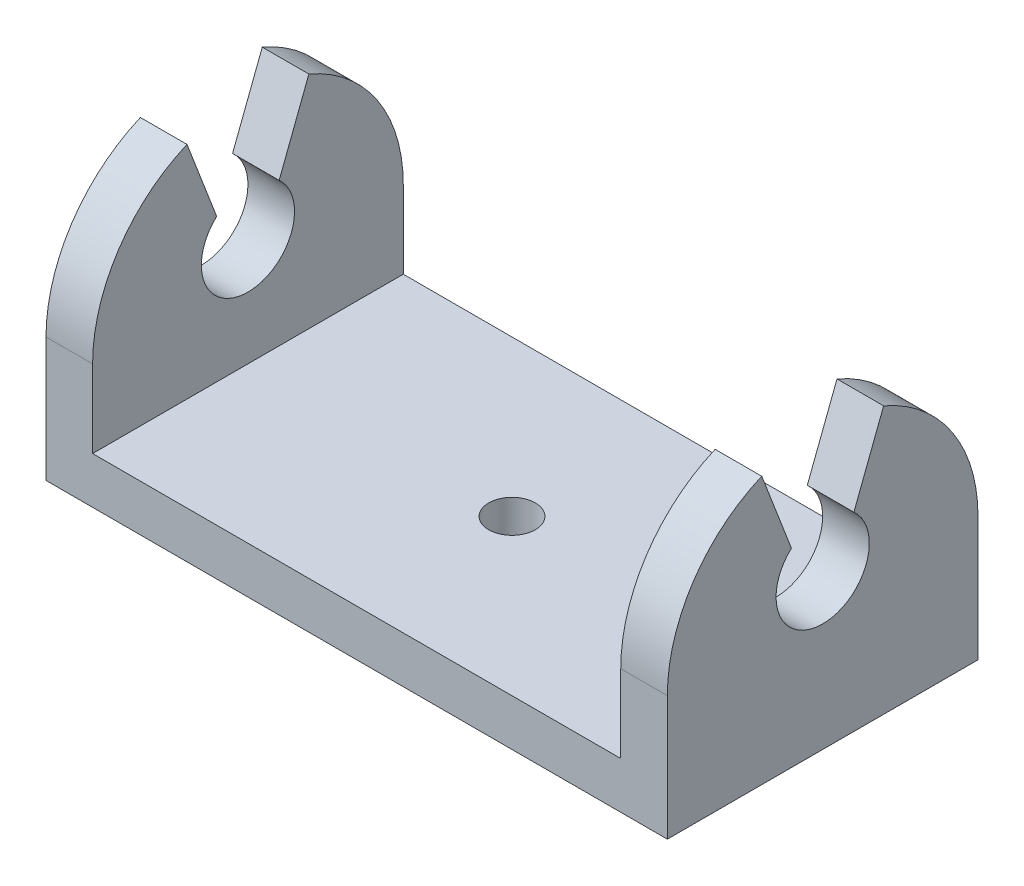
ISO-10303-21;
HEADER;
FILE_DESCRIPTION(('STEP AP214'),'2;1');
FILE_NAME('part.step','',(''),(''),'','','');
FILE_SCHEMA(('AUTOMOTIVE_DESIGN { 1 0 10303 214 1 1 1 1 }'));
ENDSEC;
DATA;
#1=APPLICATION_CONTEXT('core data for automotive mechanical design processes');
#2=APPLICATION_PROTOCOL_DEFINITION('international standard','automotive_design',2000,#1);
#3=PRODUCT_CONTEXT('',#1,'mechanical');
#4=PRODUCT('Part','Part','',(#3));
#5=PRODUCT_RELATED_PRODUCT_CATEGORY('part','',(#4));
#6=PRODUCT_DEFINITION_FORMATION('','',#4);
#7=PRODUCT_DEFINITION_CONTEXT('part definition',#1,'design');
#8=PRODUCT_DEFINITION('design','',#6,#7);
#9=PRODUCT_DEFINITION_SHAPE('','',#8);
#10=(LENGTH_UNIT() NAMED_UNIT(*) SI_UNIT(.MILLI.,.METRE.));
#11=(NAMED_UNIT(*) PLANE_ANGLE_UNIT() SI_UNIT($,.RADIAN.));
#12=(NAMED_UNIT(*) SI_UNIT($,.STERADIAN.) SOLID_ANGLE_UNIT());
#13=UNCERTAINTY_MEASURE_WITH_UNIT(LENGTH_MEASURE(1.E-05),#10,'distance_accuracy_value','');
#14=(GEOMETRIC_REPRESENTATION_CONTEXT(3) GLOBAL_UNCERTAINTY_ASSIGNED_CONTEXT((#13)) GLOBAL_UNIT_ASSIGNED_CONTEXT((#10,
#11,#12)) REPRESENTATION_CONTEXT('',''));
#15=CARTESIAN_POINT('',(0.,0.,0.));
#16=DIRECTION('',(0.,0.,1.));
#17=DIRECTION('',(1.,0.,0.));
#18=AXIS2_PLACEMENT_3D('',#15,#16,#17);
#19=CARTESIAN_POINT('',(20.,8.,0.));
#20=DIRECTION('',(-1.,0.,0.));
#21=DIRECTION('',(0.,0.,1.));
#22=AXIS2_PLACEMENT_3D('',#19,#20,#21);
#23=CYLINDRICAL_SURFACE('',#22,10.);
#24=CARTESIAN_POINT('',(20.,8.,0.));
#25=DIRECTION('',(-1.,0.,0.));
#26=DIRECTION('',(0.,0.,1.));
#27=AXIS2_PLACEMENT_3D('',#24,#25,#26);
#28=CIRCLE('',#27,10.);
#29=CARTESIAN_POINT('',(20.,17.198574319174,3.92252858429769));
#30=VERTEX_POINT('',#29);
#31=CARTESIAN_POINT('',(20.,8.,10.));
#32=VERTEX_POINT('',#31);
#33=EDGE_CURVE('E253',#30,#32,#28,.F.);
#34=ORIENTED_EDGE('',*,*,#33,.F.);
#35=DIRECTION('',(-1.,0.,0.));
#36=VECTOR('',#35,1.);
#37=CARTESIAN_POINT('',(20.,17.198574319174,3.9225285842977));
#38=LINE('',#37,#36);
#39=CARTESIAN_POINT('',(17.,17.198574319174,3.9225285842977));
#40=VERTEX_POINT('',#39);
#41=EDGE_CURVE('E162',#40,#30,#38,.F.);
#42=ORIENTED_EDGE('',*,*,#41,.F.);
#43=CARTESIAN_POINT('',(17.,8.,0.));
#44=DIRECTION('',(-1.,0.,0.));
#45=DIRECTION('',(0.,0.,1.));
#46=AXIS2_PLACEMENT_3D('',#43,#44,#45);
#47=CIRCLE('',#46,10.);
#48=CARTESIAN_POINT('',(17.,8.,10.));
#49=VERTEX_POINT('',#48);
#50=EDGE_CURVE('E11',#49,#40,#47,.T.);
#51=ORIENTED_EDGE('',*,*,#50,.F.);
#52=DIRECTION('',(1.,0.,0.));
#53=VECTOR('',#52,1.);
#54=CARTESIAN_POINT('',(20.,8.,10.));
#55=LINE('',#54,#53);
#56=EDGE_CURVE('E248',#32,#49,#55,.F.);
#57=ORIENTED_EDGE('',*,*,#56,.F.);
#58=EDGE_LOOP('',(#34,#42,#51,#57));
#59=FACE_BOUND('',#58,.T.);
#60=ADVANCED_FACE('F35',(#59),#23,.T.);
#61=CARTESIAN_POINT('',(17.,17.198574319174,-3.9225285842977));
#62=VERTEX_POINT('',#61);
#63=CARTESIAN_POINT('',(17.,8.,-10.));
#64=VERTEX_POINT('',#63);
#65=EDGE_CURVE('E43',#62,#64,#47,.T.);
#66=ORIENTED_EDGE('',*,*,#65,.F.);
#67=DIRECTION('',(-1.,0.,0.));
#68=VECTOR('',#67,1.);
#69=CARTESIAN_POINT('',(20.,17.198574319174,-3.9225285842977));
#70=LINE('',#69,#68);
#71=CARTESIAN_POINT('',(20.,17.198574319174,-3.92252858429769));
#72=VERTEX_POINT('',#71);
#73=EDGE_CURVE('E154',#72,#62,#70,.T.);
#74=ORIENTED_EDGE('',*,*,#73,.F.);
#75=CARTESIAN_POINT('',(20.,8.,-10.));
#76=VERTEX_POINT('',#75);
#77=EDGE_CURVE('E254',#76,#72,#28,.F.);
#78=ORIENTED_EDGE('',*,*,#77,.F.);
#79=DIRECTION('',(-1.,0.,0.));
#80=VECTOR('',#79,1.);
#81=CARTESIAN_POINT('',(-20.,8.,-10.));
#82=LINE('',#81,#80);
#83=EDGE_CURVE('E251',#64,#76,#82,.F.);
#84=ORIENTED_EDGE('',*,*,#83,.F.);
#85=EDGE_LOOP('',(#66,#74,#78,#84));
#86=FACE_BOUND('',#85,.T.);
#87=ADVANCED_FACE('F286',(#86),#23,.T.);
#88=CARTESIAN_POINT('',(20.,3.,10.));
#89=DIRECTION('',(-1.,0.,0.));
#90=DIRECTION('',(0.,0.,1.));
#91=AXIS2_PLACEMENT_3D('',#88,#89,#90);
#92=PLANE('',#91);
#93=DIRECTION('',(0.,0.93334560620306,0.358979079308869));
#94=VECTOR('',#93,1.);
#95=CARTESIAN_POINT('',(20.,7.,0.));
#96=LINE('',#95,#94);
#97=CARTESIAN_POINT('',(20.,12.2268041237113,2.01030927835052));
#98=VERTEX_POINT('',#97);
#99=EDGE_CURVE('E50',#98,#30,#96,.T.);
#100=ORIENTED_EDGE('',*,*,#99,.T.);
#101=ORIENTED_EDGE('',*,*,#33,.T.);
#102=DIRECTION('',(0.,-1.,0.));
#103=VECTOR('',#102,1.);
#104=CARTESIAN_POINT('',(20.,3.,10.));
#105=LINE('',#104,#103);
#106=CARTESIAN_POINT('',(20.,0.,10.));
#107=VERTEX_POINT('',#106);
#108=EDGE_CURVE('E232',#32,#107,#105,.T.);
#109=ORIENTED_EDGE('',*,*,#108,.T.);
#110=DIRECTION('',(0.,0.,-1.));
#111=VECTOR('',#110,1.);
#112=CARTESIAN_POINT('',(20.,0.,10.));
#113=LINE('',#112,#111);
#114=CARTESIAN_POINT('',(20.,0.,-10.));
#115=VERTEX_POINT('',#114);
#116=EDGE_CURVE('E219',#107,#115,#113,.T.);
#117=ORIENTED_EDGE('',*,*,#116,.T.);
#118=DIRECTION('',(0.,-1.,0.));
#119=VECTOR('',#118,1.);
#120=CARTESIAN_POINT('',(20.,3.,-10.));
#121=LINE('',#120,#119);
#122=EDGE_CURVE('E230',#76,#115,#121,.T.);
#123=ORIENTED_EDGE('',*,*,#122,.F.);
#124=ORIENTED_EDGE('',*,*,#77,.T.);
#125=DIRECTION('',(0.,-0.93334560620306,0.358979079308869));
#126=VECTOR('',#125,1.);
#127=CARTESIAN_POINT('',(20.,20.,-5.));
#128=LINE('',#127,#126);
#129=CARTESIAN_POINT('',(20.,12.2268041237113,-2.01030927835052));
#130=VERTEX_POINT('',#129);
#131=EDGE_CURVE('E293',#72,#130,#128,.T.);
#132=ORIENTED_EDGE('',*,*,#131,.T.);
#133=CARTESIAN_POINT('',(20.,10.,0.));
#134=DIRECTION('',(-1.,0.,0.));
#135=DIRECTION('',(0.,0.,1.));
#136=AXIS2_PLACEMENT_3D('',#133,#134,#135);
#137=CIRCLE('',#136,3.);
#138=EDGE_CURVE('E166',#130,#98,#137,.T.);
#139=ORIENTED_EDGE('',*,*,#138,.T.);
#140=EDGE_LOOP('',(#100,#101,#109,#117,#123,#124,#132,#139));
#141=FACE_BOUND('',#140,.T.);
#142=ADVANCED_FACE('F261',(#141),#92,.F.);
#143=CARTESIAN_POINT('',(17.,18.,-10.));
#144=DIRECTION('',(-1.,0.,0.));
#145=DIRECTION('',(0.,0.,1.));
#146=AXIS2_PLACEMENT_3D('',#143,#144,#145);
#147=PLANE('',#146);
#148=ORIENTED_EDGE('',*,*,#50,.T.);
#149=DIRECTION('',(0.,0.93334560620306,0.358979079308869));
#150=VECTOR('',#149,1.);
#151=CARTESIAN_POINT('',(17.,7.,0.));
#152=LINE('',#151,#150);
#153=CARTESIAN_POINT('',(17.,12.2268041237113,2.01030927835052));
#154=VERTEX_POINT('',#153);
#155=EDGE_CURVE('E148',#154,#40,#152,.T.);
#156=ORIENTED_EDGE('',*,*,#155,.F.);
#157=CARTESIAN_POINT('',(17.,10.,0.));
#158=DIRECTION('',(-1.,0.,0.));
#159=DIRECTION('',(0.,0.,1.));
#160=AXIS2_PLACEMENT_3D('',#157,#158,#159);
#161=CIRCLE('',#160,3.);
#162=CARTESIAN_POINT('',(17.,12.2268041237113,-2.01030927835052));
#163=VERTEX_POINT('',#162);
#164=EDGE_CURVE('E160',#163,#154,#161,.T.);
#165=ORIENTED_EDGE('',*,*,#164,.F.);
#166=DIRECTION('',(0.,-0.93334560620306,0.358979079308869));
#167=VECTOR('',#166,1.);
#168=CARTESIAN_POINT('',(17.,20.,-5.));
#169=LINE('',#168,#167);
#170=EDGE_CURVE('E58',#62,#163,#169,.T.);
#171=ORIENTED_EDGE('',*,*,#170,.F.);
#172=ORIENTED_EDGE('',*,*,#65,.T.);
#173=DIRECTION('',(0.,-1.,0.));
#174=VECTOR('',#173,1.);
#175=CARTESIAN_POINT('',(17.,18.,-10.));
#176=LINE('',#175,#174);
#177=CARTESIAN_POINT('',(17.,3.,-10.));
#178=VERTEX_POINT('',#177);
#179=EDGE_CURVE('E175',#64,#178,#176,.T.);
#180=ORIENTED_EDGE('',*,*,#179,.T.);
#181=DIRECTION('',(0.,0.,-1.));
#182=VECTOR('',#181,1.);
#183=CARTESIAN_POINT('',(17.,3.,-10.));
#184=LINE('',#183,#182);
#185=CARTESIAN_POINT('',(17.,3.,10.));
#186=VERTEX_POINT('',#185);
#187=EDGE_CURVE('E165',#186,#178,#184,.T.);
#188=ORIENTED_EDGE('',*,*,#187,.F.);
#189=DIRECTION('',(0.,-1.,0.));
#190=VECTOR('',#189,1.);
#191=CARTESIAN_POINT('',(17.,18.,10.));
#192=LINE('',#191,#190);
#193=EDGE_CURVE('E169',#49,#186,#192,.T.);
#194=ORIENTED_EDGE('',*,*,#193,.F.);
#195=EDGE_LOOP('',(#148,#156,#165,#171,#172,#180,#188,#194));
#196=FACE_BOUND('',#195,.T.);
#197=ADVANCED_FACE('F159',(#196),#147,.T.);
#198=CARTESIAN_POINT('',(-20.001,10.,0.));
#199=DIRECTION('',(1.,0.,0.));
#200=DIRECTION('',(0.,0.,-1.));
#201=AXIS2_PLACEMENT_3D('',#198,#199,#200);
#202=CYLINDRICAL_SURFACE('',#201,3.);
#203=ORIENTED_EDGE('',*,*,#164,.T.);
#204=DIRECTION('',(1.,0.,0.));
#205=VECTOR('',#204,1.);
#206=CARTESIAN_POINT('',(-20.001,12.2268041237113,2.01030927835052));
#207=LINE('',#206,#205);
#208=EDGE_CURVE('E145',#98,#154,#207,.F.);
#209=ORIENTED_EDGE('',*,*,#208,.F.);
#210=ORIENTED_EDGE('',*,*,#138,.F.);
#211=DIRECTION('',(1.,0.,0.));
#212=VECTOR('',#211,1.);
#213=CARTESIAN_POINT('',(-20.001,12.2268041237113,-2.01030927835052));
#214=LINE('',#213,#212);
#215=EDGE_CURVE('E155',#163,#130,#214,.T.);
#216=ORIENTED_EDGE('',*,*,#215,.F.);
#217=EDGE_LOOP('',(#203,#209,#210,#216));
#218=FACE_BOUND('',#217,.T.);
#219=ADVANCED_FACE('F164',(#218),#202,.F.);
#220=CARTESIAN_POINT('',(-17.,8.,0.));
#221=DIRECTION('',(1.,0.,0.));
#222=DIRECTION('',(0.,0.,-1.));
#223=AXIS2_PLACEMENT_3D('',#220,#221,#222);
#224=CYLINDRICAL_SURFACE('',#223,10.);
#225=DIRECTION('',(1.,0.,0.));
#226=VECTOR('',#225,1.);
#227=CARTESIAN_POINT('',(-17.,17.198574319174,3.92252858429769));
#228=LINE('',#227,#226);
#229=CARTESIAN_POINT('',(-17.,17.198574319174,3.92252858429769));
#230=VERTEX_POINT('',#229);
#231=CARTESIAN_POINT('',(-20.,17.198574319174,3.92252858429769));
#232=VERTEX_POINT('',#231);
#233=EDGE_CURVE('E184',#230,#232,#228,.F.);
#234=ORIENTED_EDGE('',*,*,#233,.T.);
#235=CARTESIAN_POINT('',(-20.,8.,0.));
#236=DIRECTION('',(-1.,0.,0.));
#237=DIRECTION('',(0.,0.,1.));
#238=AXIS2_PLACEMENT_3D('',#235,#236,#237);
#239=CIRCLE('',#238,10.);
#240=CARTESIAN_POINT('',(-20.,8.,10.));
#241=VERTEX_POINT('',#240);
#242=EDGE_CURVE('E245',#241,#232,#239,.T.);
#243=ORIENTED_EDGE('',*,*,#242,.F.);
#244=DIRECTION('',(-1.,0.,0.));
#245=VECTOR('',#244,1.);
#246=CARTESIAN_POINT('',(-17.,8.,10.));
#247=LINE('',#246,#245);
#248=CARTESIAN_POINT('',(-17.,8.,10.));
#249=VERTEX_POINT('',#248);
#250=EDGE_CURVE('E234',#249,#241,#247,.T.);
#251=ORIENTED_EDGE('',*,*,#250,.F.);
#252=CARTESIAN_POINT('',(-17.,8.,0.));
#253=DIRECTION('',(-1.,0.,0.));
#254=DIRECTION('',(0.,0.,1.));
#255=AXIS2_PLACEMENT_3D('',#252,#253,#254);
#256=CIRCLE('',#255,10.);
#257=EDGE_CURVE('E240',#230,#249,#256,.F.);
#258=ORIENTED_EDGE('',*,*,#257,.F.);
#259=EDGE_LOOP('',(#234,#243,#251,#258));
#260=FACE_BOUND('',#259,.T.);
#261=ADVANCED_FACE('F344',(#260),#224,.T.);
#262=DIRECTION('',(1.,0.,0.));
#263=VECTOR('',#262,1.);
#264=CARTESIAN_POINT('',(-17.,17.198574319174,-3.92252858429769));
#265=LINE('',#264,#263);
#266=CARTESIAN_POINT('',(-20.,17.198574319174,-3.92252858429769));
#267=VERTEX_POINT('',#266);
#268=CARTESIAN_POINT('',(-17.,17.198574319174,-3.9225285842977));
#269=VERTEX_POINT('',#268);
#270=EDGE_CURVE('E181',#267,#269,#265,.T.);
#271=ORIENTED_EDGE('',*,*,#270,.T.);
#272=CARTESIAN_POINT('',(-17.,8.,-10.));
#273=VERTEX_POINT('',#272);
#274=EDGE_CURVE('E241',#273,#269,#256,.F.);
#275=ORIENTED_EDGE('',*,*,#274,.F.);
#276=DIRECTION('',(1.,0.,0.));
#277=VECTOR('',#276,1.);
#278=CARTESIAN_POINT('',(-20.,8.,-10.));
#279=LINE('',#278,#277);
#280=CARTESIAN_POINT('',(-20.,8.,-10.));
#281=VERTEX_POINT('',#280);
#282=EDGE_CURVE('E237',#281,#273,#279,.T.);
#283=ORIENTED_EDGE('',*,*,#282,.F.);
#284=EDGE_CURVE('E244',#267,#281,#239,.T.);
#285=ORIENTED_EDGE('',*,*,#284,.F.);
#286=EDGE_LOOP('',(#271,#275,#283,#285));
#287=FACE_BOUND('',#286,.T.);
#288=ADVANCED_FACE('F339',(#287),#224,.T.);
#289=CARTESIAN_POINT('',(-20.,3.,10.));
#290=DIRECTION('',(0.,0.,-1.));
#291=DIRECTION('',(-1.,0.,0.));
#292=AXIS2_PLACEMENT_3D('',#289,#290,#291);
#293=PLANE('',#292);
#294=ORIENTED_EDGE('',*,*,#108,.F.);
#295=ORIENTED_EDGE('',*,*,#56,.T.);
#296=ORIENTED_EDGE('',*,*,#193,.T.);
#297=DIRECTION('',(1.,0.,0.));
#298=VECTOR('',#297,1.);
#299=CARTESIAN_POINT('',(-20.,3.,10.));
#300=LINE('',#299,#298);
#301=CARTESIAN_POINT('',(-17.,3.,10.));
#302=VERTEX_POINT('',#301);
#303=EDGE_CURVE('E209',#302,#186,#300,.T.);
#304=ORIENTED_EDGE('',*,*,#303,.F.);
#305=DIRECTION('',(0.,-1.,0.));
#306=VECTOR('',#305,1.);
#307=CARTESIAN_POINT('',(-17.,18.,10.));
#308=LINE('',#307,#306);
#309=EDGE_CURVE('E206',#249,#302,#308,.T.);
#310=ORIENTED_EDGE('',*,*,#309,.F.);
#311=ORIENTED_EDGE('',*,*,#250,.T.);
#312=DIRECTION('',(0.,-1.,0.));
#313=VECTOR('',#312,1.);
#314=CARTESIAN_POINT('',(-20.,3.,10.));
#315=LINE('',#314,#313);
#316=CARTESIAN_POINT('',(-20.,0.,10.));
#317=VERTEX_POINT('',#316);
#318=EDGE_CURVE('E216',#241,#317,#315,.T.);
#319=ORIENTED_EDGE('',*,*,#318,.T.);
#320=DIRECTION('',(1.,0.,0.));
#321=VECTOR('',#320,1.);
#322=CARTESIAN_POINT('',(-20.,0.,10.));
#323=LINE('',#322,#321);
#324=EDGE_CURVE('E208',#317,#107,#323,.T.);
#325=ORIENTED_EDGE('',*,*,#324,.T.);
#326=EDGE_LOOP('',(#294,#295,#296,#304,#310,#311,#319,#325));
#327=FACE_BOUND('',#326,.T.);
#328=ADVANCED_FACE('F266',(#327),#293,.F.);
#329=CARTESIAN_POINT('',(-20.,3.,-10.));
#330=DIRECTION('',(0.,0.,-1.));
#331=DIRECTION('',(-1.,0.,0.));
#332=AXIS2_PLACEMENT_3D('',#329,#330,#331);
#333=PLANE('',#332);
#334=ORIENTED_EDGE('',*,*,#179,.F.);
#335=ORIENTED_EDGE('',*,*,#83,.T.);
#336=ORIENTED_EDGE('',*,*,#122,.T.);
#337=DIRECTION('',(1.,0.,0.));
#338=VECTOR('',#337,1.);
#339=CARTESIAN_POINT('',(-20.,0.,-10.));
#340=LINE('',#339,#338);
#341=CARTESIAN_POINT('',(-20.,0.,-10.));
#342=VERTEX_POINT('',#341);
#343=EDGE_CURVE('E222',#342,#115,#340,.T.);
#344=ORIENTED_EDGE('',*,*,#343,.F.);
#345=DIRECTION('',(0.,-1.,0.));
#346=VECTOR('',#345,1.);
#347=CARTESIAN_POINT('',(-20.,3.,-10.));
#348=LINE('',#347,#346);
#349=EDGE_CURVE('E228',#281,#342,#348,.T.);
#350=ORIENTED_EDGE('',*,*,#349,.F.);
#351=ORIENTED_EDGE('',*,*,#282,.T.);
#352=DIRECTION('',(0.,-1.,0.));
#353=VECTOR('',#352,1.);
#354=CARTESIAN_POINT('',(-17.,18.,-10.));
#355=LINE('',#354,#353);
#356=CARTESIAN_POINT('',(-17.,3.,-10.));
#357=VERTEX_POINT('',#356);
#358=EDGE_CURVE('E204',#273,#357,#355,.T.);
#359=ORIENTED_EDGE('',*,*,#358,.T.);
#360=DIRECTION('',(1.,0.,0.));
#361=VECTOR('',#360,1.);
#362=CARTESIAN_POINT('',(-20.,3.,-10.));
#363=LINE('',#362,#361);
#364=EDGE_CURVE('E212',#357,#178,#363,.T.);
#365=ORIENTED_EDGE('',*,*,#364,.T.);
#366=EDGE_LOOP('',(#334,#335,#336,#344,#350,#351,#359,#365));
#367=FACE_BOUND('',#366,.T.);
#368=ADVANCED_FACE('F282',(#367),#333,.T.);
#369=CARTESIAN_POINT('',(-20.,3.,10.));
#370=DIRECTION('',(-1.,0.,0.));
#371=DIRECTION('',(0.,0.,1.));
#372=AXIS2_PLACEMENT_3D('',#369,#370,#371);
#373=PLANE('',#372);
#374=DIRECTION('',(0.,0.93334560620306,0.358979079308869));
#375=VECTOR('',#374,1.);
#376=CARTESIAN_POINT('',(-20.,7.,0.));
#377=LINE('',#376,#375);
#378=CARTESIAN_POINT('',(-20.,12.2268041237113,2.01030927835052));
#379=VERTEX_POINT('',#378);
#380=EDGE_CURVE('E189',#379,#232,#377,.T.);
#381=ORIENTED_EDGE('',*,*,#380,.F.);
#382=CARTESIAN_POINT('',(-20.,10.,0.));
#383=DIRECTION('',(-1.,0.,0.));
#384=DIRECTION('',(0.,0.,1.));
#385=AXIS2_PLACEMENT_3D('',#382,#383,#384);
#386=CIRCLE('',#385,3.);
#387=CARTESIAN_POINT('',(-20.,12.2268041237113,-2.01030927835052));
#388=VERTEX_POINT('',#387);
#389=EDGE_CURVE('E195',#388,#379,#386,.T.);
#390=ORIENTED_EDGE('',*,*,#389,.F.);
#391=DIRECTION('',(0.,-0.93334560620306,0.358979079308869));
#392=VECTOR('',#391,1.);
#393=CARTESIAN_POINT('',(-20.,20.,-5.));
#394=LINE('',#393,#392);
#395=EDGE_CURVE('E191',#267,#388,#394,.T.);
#396=ORIENTED_EDGE('',*,*,#395,.F.);
#397=ORIENTED_EDGE('',*,*,#284,.T.);
#398=ORIENTED_EDGE('',*,*,#349,.T.);
#399=DIRECTION('',(0.,0.,-1.));
#400=VECTOR('',#399,1.);
#401=CARTESIAN_POINT('',(-20.,0.,10.));
#402=LINE('',#401,#400);
#403=EDGE_CURVE('E213',#317,#342,#402,.T.);
#404=ORIENTED_EDGE('',*,*,#403,.F.);
#405=ORIENTED_EDGE('',*,*,#318,.F.);
#406=ORIENTED_EDGE('',*,*,#242,.T.);
#407=EDGE_LOOP('',(#381,#390,#396,#397,#398,#404,#405,#406));
#408=FACE_BOUND('',#407,.T.);
#409=ADVANCED_FACE('F274',(#408),#373,.T.);
#410=CARTESIAN_POINT('',(0.,3.,0.));
#411=DIRECTION('',(0.,1.,0.));
#412=DIRECTION('',(0.,0.,1.));
#413=AXIS2_PLACEMENT_3D('',#410,#411,#412);
#414=PLANE('',#413);
#415=CARTESIAN_POINT('',(0.,3.,0.));
#416=DIRECTION('',(0.,1.,0.));
#417=DIRECTION('',(0.,0.,1.));
#418=AXIS2_PLACEMENT_3D('',#415,#416,#417);
#419=CIRCLE('',#418,1.5);
#420=CARTESIAN_POINT('',(0.,3.,1.5));
#421=VERTEX_POINT('',#420);
#422=EDGE_CURVE('E297',#421,#421,#419,.F.);
#423=ORIENTED_EDGE('',*,*,#422,.T.);
#424=EDGE_LOOP('',(#423));
#425=FACE_BOUND('',#424,.T.);
#426=ORIENTED_EDGE('',*,*,#187,.T.);
#427=ORIENTED_EDGE('',*,*,#364,.F.);
#428=DIRECTION('',(0.,0.,-1.));
#429=VECTOR('',#428,1.);
#430=CARTESIAN_POINT('',(-17.,3.,-10.));
#431=LINE('',#430,#429);
#432=EDGE_CURVE('E201',#302,#357,#431,.T.);
#433=ORIENTED_EDGE('',*,*,#432,.F.);
#434=ORIENTED_EDGE('',*,*,#303,.T.);
#435=EDGE_LOOP('',(#426,#427,#433,#434));
#436=FACE_BOUND('',#435,.T.);
#437=ADVANCED_FACE('F303',(#425,#436),#414,.T.);
#438=CARTESIAN_POINT('',(0.,0.,0.));
#439=DIRECTION('',(0.,1.,0.));
#440=DIRECTION('',(0.,0.,1.));
#441=AXIS2_PLACEMENT_3D('',#438,#439,#440);
#442=PLANE('',#441);
#443=CARTESIAN_POINT('',(0.,0.,0.));
#444=DIRECTION('',(0.,-1.,0.));
#445=DIRECTION('',(0.,0.,-1.));
#446=AXIS2_PLACEMENT_3D('',#443,#444,#445);
#447=CIRCLE('',#446,1.5);
#448=CARTESIAN_POINT('',(0.,0.,-1.5));
#449=VERTEX_POINT('',#448);
#450=EDGE_CURVE('E295',#449,#449,#447,.T.);
#451=ORIENTED_EDGE('',*,*,#450,.F.);
#452=EDGE_LOOP('',(#451));
#453=FACE_BOUND('',#452,.T.);
#454=ORIENTED_EDGE('',*,*,#324,.F.);
#455=ORIENTED_EDGE('',*,*,#403,.T.);
#456=ORIENTED_EDGE('',*,*,#343,.T.);
#457=ORIENTED_EDGE('',*,*,#116,.F.);
#458=EDGE_LOOP('',(#454,#455,#456,#457));
#459=FACE_BOUND('',#458,.T.);
#460=ADVANCED_FACE('F271',(#453,#459),#442,.F.);
#461=CARTESIAN_POINT('',(-17.,18.,-10.));
#462=DIRECTION('',(-1.,0.,0.));
#463=DIRECTION('',(0.,0.,1.));
#464=AXIS2_PLACEMENT_3D('',#461,#462,#463);
#465=PLANE('',#464);
#466=CARTESIAN_POINT('',(-17.,10.,0.));
#467=DIRECTION('',(-1.,0.,0.));
#468=DIRECTION('',(0.,0.,1.));
#469=AXIS2_PLACEMENT_3D('',#466,#467,#468);
#470=CIRCLE('',#469,3.);
#471=CARTESIAN_POINT('',(-17.,12.2268041237113,2.01030927835052));
#472=VERTEX_POINT('',#471);
#473=CARTESIAN_POINT('',(-17.,12.2268041237113,-2.01030927835052));
#474=VERTEX_POINT('',#473);
#475=EDGE_CURVE('E198',#472,#474,#470,.F.);
#476=ORIENTED_EDGE('',*,*,#475,.F.);
#477=DIRECTION('',(0.,-0.93334560620306,-0.358979079308869));
#478=VECTOR('',#477,1.);
#479=CARTESIAN_POINT('',(-17.,7.,0.));
#480=LINE('',#479,#478);
#481=EDGE_CURVE('E187',#230,#472,#480,.T.);
#482=ORIENTED_EDGE('',*,*,#481,.F.);
#483=ORIENTED_EDGE('',*,*,#257,.T.);
#484=ORIENTED_EDGE('',*,*,#309,.T.);
#485=ORIENTED_EDGE('',*,*,#432,.T.);
#486=ORIENTED_EDGE('',*,*,#358,.F.);
#487=ORIENTED_EDGE('',*,*,#274,.T.);
#488=DIRECTION('',(0.,0.93334560620306,-0.358979079308869));
#489=VECTOR('',#488,1.);
#490=CARTESIAN_POINT('',(-17.,20.,-5.));
#491=LINE('',#490,#489);
#492=EDGE_CURVE('E193',#474,#269,#491,.T.);
#493=ORIENTED_EDGE('',*,*,#492,.F.);
#494=EDGE_LOOP('',(#476,#482,#483,#484,#485,#486,#487,#493));
#495=FACE_BOUND('',#494,.T.);
#496=ADVANCED_FACE('F313',(#495),#465,.F.);
#497=CARTESIAN_POINT('',(20.001,10.,0.));
#498=DIRECTION('',(-1.,0.,0.));
#499=DIRECTION('',(0.,0.,1.));
#500=AXIS2_PLACEMENT_3D('',#497,#498,#499);
#501=CYLINDRICAL_SURFACE('',#500,3.);
#502=ORIENTED_EDGE('',*,*,#389,.T.);
#503=DIRECTION('',(-1.,0.,0.));
#504=VECTOR('',#503,1.);
#505=CARTESIAN_POINT('',(20.001,12.2268041237113,2.01030927835052));
#506=LINE('',#505,#504);
#507=EDGE_CURVE('E179',#472,#379,#506,.T.);
#508=ORIENTED_EDGE('',*,*,#507,.F.);
#509=ORIENTED_EDGE('',*,*,#475,.T.);
#510=DIRECTION('',(-1.,0.,0.));
#511=VECTOR('',#510,1.);
#512=CARTESIAN_POINT('',(20.001,12.2268041237113,-2.01030927835052));
#513=LINE('',#512,#511);
#514=EDGE_CURVE('E177',#388,#474,#513,.F.);
#515=ORIENTED_EDGE('',*,*,#514,.F.);
#516=EDGE_LOOP('',(#502,#508,#509,#515));
#517=FACE_BOUND('',#516,.T.);
#518=ADVANCED_FACE('F319',(#517),#501,.F.);
#519=CARTESIAN_POINT('',(20.001,20.,-5.));
#520=DIRECTION('',(0.,-0.358979079308869,-0.93334560620306));
#521=DIRECTION('',(0.,0.93334560620306,-0.358979079308869));
#522=AXIS2_PLACEMENT_3D('',#519,#520,#521);
#523=PLANE('',#522);
#524=ORIENTED_EDGE('',*,*,#395,.T.);
#525=ORIENTED_EDGE('',*,*,#514,.T.);
#526=ORIENTED_EDGE('',*,*,#492,.T.);
#527=ORIENTED_EDGE('',*,*,#270,.F.);
#528=EDGE_LOOP('',(#524,#525,#526,#527));
#529=FACE_BOUND('',#528,.T.);
#530=ADVANCED_FACE('F367',(#529),#523,.F.);
#531=CARTESIAN_POINT('',(20.001,7.,0.));
#532=DIRECTION('',(0.,-0.358979079308869,0.93334560620306));
#533=DIRECTION('',(0.,-0.93334560620306,-0.358979079308869));
#534=AXIS2_PLACEMENT_3D('',#531,#532,#533);
#535=PLANE('',#534);
#536=ORIENTED_EDGE('',*,*,#481,.T.);
#537=ORIENTED_EDGE('',*,*,#507,.T.);
#538=ORIENTED_EDGE('',*,*,#380,.T.);
#539=ORIENTED_EDGE('',*,*,#233,.F.);
#540=EDGE_LOOP('',(#536,#537,#538,#539));
#541=FACE_BOUND('',#540,.T.);
#542=ADVANCED_FACE('F369',(#541),#535,.F.);
#543=CARTESIAN_POINT('',(-20.001,20.,-5.));
#544=DIRECTION('',(0.,0.358979079308869,0.93334560620306));
#545=DIRECTION('',(0.,-0.93334560620306,0.358979079308869));
#546=AXIS2_PLACEMENT_3D('',#543,#544,#545);
#547=PLANE('',#546);
#548=ORIENTED_EDGE('',*,*,#73,.T.);
#549=ORIENTED_EDGE('',*,*,#170,.T.);
#550=ORIENTED_EDGE('',*,*,#215,.T.);
#551=ORIENTED_EDGE('',*,*,#131,.F.);
#552=EDGE_LOOP('',(#548,#549,#550,#551));
#553=FACE_BOUND('',#552,.T.);
#554=ADVANCED_FACE('F294',(#553),#547,.T.);
#555=CARTESIAN_POINT('',(-20.001,7.,0.));
#556=DIRECTION('',(0.,0.358979079308869,-0.93334560620306));
#557=DIRECTION('',(0.,0.93334560620306,0.358979079308869));
#558=AXIS2_PLACEMENT_3D('',#555,#556,#557);
#559=PLANE('',#558);
#560=ORIENTED_EDGE('',*,*,#41,.T.);
#561=ORIENTED_EDGE('',*,*,#99,.F.);
#562=ORIENTED_EDGE('',*,*,#208,.T.);
#563=ORIENTED_EDGE('',*,*,#155,.T.);
#564=EDGE_LOOP('',(#560,#561,#562,#563));
#565=FACE_BOUND('',#564,.T.);
#566=ADVANCED_FACE('F147',(#565),#559,.T.);
#567=CARTESIAN_POINT('',(0.,17.199574319174,0.));
#568=DIRECTION('',(0.,-1.,0.));
#569=DIRECTION('',(0.,0.,-1.));
#570=AXIS2_PLACEMENT_3D('',#567,#568,#569);
#571=CYLINDRICAL_SURFACE('',#570,1.5);
#572=ORIENTED_EDGE('',*,*,#422,.F.);
#573=EDGE_LOOP('',(#572));
#574=FACE_BOUND('',#573,.T.);
#575=ORIENTED_EDGE('',*,*,#450,.T.);
#576=EDGE_LOOP('',(#575));
#577=FACE_BOUND('',#576,.T.);
#578=ADVANCED_FACE('F306',(#574,#577),#571,.F.);
#579=CLOSED_SHELL('',(#60,#87,#142,#197,#219,#261,#288,#328,#368,#409,#437,#460,#496,#518,#530,
#542,#554,#566,#578));
#580=MANIFOLD_SOLID_BREP('B2',#579);
#581=ADVANCED_BREP_SHAPE_REPRESENTATION('',(#18,#580),#14);
#582=SHAPE_DEFINITION_REPRESENTATION(#9,#581);
ENDSEC;
END-ISO-10303-21;
